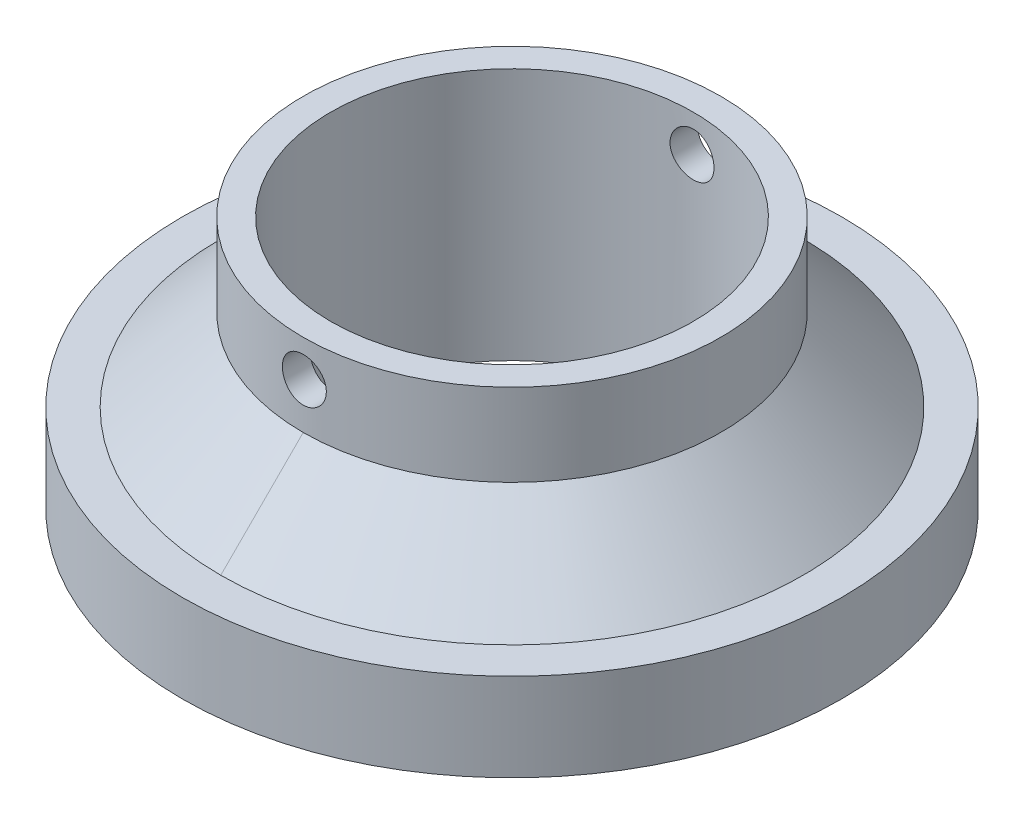
ISO-10303-21;
HEADER;
FILE_DESCRIPTION(('STEP AP214'),'2;1');
FILE_NAME('part.step','',(''),(''),'','','');
FILE_SCHEMA(('AUTOMOTIVE_DESIGN { 1 0 10303 214 1 1 1 1 }'));
ENDSEC;
DATA;
#1=APPLICATION_CONTEXT('core data for automotive mechanical design processes');
#2=APPLICATION_PROTOCOL_DEFINITION('international standard','automotive_design',2000,#1);
#3=PRODUCT_CONTEXT('',#1,'mechanical');
#4=PRODUCT('Part','Part','',(#3));
#5=PRODUCT_RELATED_PRODUCT_CATEGORY('part','',(#4));
#6=PRODUCT_DEFINITION_FORMATION('','',#4);
#7=PRODUCT_DEFINITION_CONTEXT('part definition',#1,'design');
#8=PRODUCT_DEFINITION('design','',#6,#7);
#9=PRODUCT_DEFINITION_SHAPE('','',#8);
#10=(LENGTH_UNIT() NAMED_UNIT(*) SI_UNIT(.MILLI.,.METRE.));
#11=(NAMED_UNIT(*) PLANE_ANGLE_UNIT() SI_UNIT($,.RADIAN.));
#12=(NAMED_UNIT(*) SI_UNIT($,.STERADIAN.) SOLID_ANGLE_UNIT());
#13=UNCERTAINTY_MEASURE_WITH_UNIT(LENGTH_MEASURE(1.E-05),#10,'distance_accuracy_value','');
#14=(GEOMETRIC_REPRESENTATION_CONTEXT(3) GLOBAL_UNCERTAINTY_ASSIGNED_CONTEXT((#13)) GLOBAL_UNIT_ASSIGNED_CONTEXT((#10,
#11,#12)) REPRESENTATION_CONTEXT('',''));
#15=CARTESIAN_POINT('',(0.,0.,0.));
#16=DIRECTION('',(0.,0.,1.));
#17=DIRECTION('',(1.,0.,0.));
#18=AXIS2_PLACEMENT_3D('',#15,#16,#17);
#19=CARTESIAN_POINT('',(0.,23.,0.));
#20=DIRECTION('',(0.,-1.,0.));
#21=DIRECTION('',(0.,0.,-1.));
#22=AXIS2_PLACEMENT_3D('',#19,#20,#21);
#23=CYLINDRICAL_SURFACE('',#22,19.);
#24=CARTESIAN_POINT('',(0.,23.,0.));
#25=DIRECTION('',(0.,1.,0.));
#26=DIRECTION('',(0.,0.,1.));
#27=AXIS2_PLACEMENT_3D('',#24,#25,#26);
#28=CIRCLE('',#27,19.);
#29=CARTESIAN_POINT('',(0.,23.,19.));
#30=VERTEX_POINT('',#29);
#31=EDGE_CURVE('E104',#30,#30,#28,.T.);
#32=ORIENTED_EDGE('',*,*,#31,.F.);
#33=EDGE_LOOP('',(#32));
#34=FACE_BOUND('',#33,.T.);
#35=CARTESIAN_POINT('',(0.,15.5,0.));
#36=DIRECTION('',(0.,-1.,0.));
#37=DIRECTION('',(-1.,0.,0.));
#38=AXIS2_PLACEMENT_3D('',#35,#36,#37);
#39=CIRCLE('',#38,19.);
#40=CARTESIAN_POINT('',(-19.,15.5,0.));
#41=VERTEX_POINT('',#40);
#42=CARTESIAN_POINT('',(0.,15.5,19.));
#43=VERTEX_POINT('',#42);
#44=EDGE_CURVE('E74',#41,#43,#39,.T.);
#45=ORIENTED_EDGE('',*,*,#44,.F.);
#46=CARTESIAN_POINT('',(0.,15.5,0.));
#47=DIRECTION('',(0.,-1.,0.));
#48=DIRECTION('',(0.,0.,1.));
#49=AXIS2_PLACEMENT_3D('',#46,#47,#48);
#50=CIRCLE('',#49,19.);
#51=EDGE_CURVE('E68',#43,#41,#50,.T.);
#52=ORIENTED_EDGE('',*,*,#51,.F.);
#53=EDGE_LOOP('',(#45,#52));
#54=FACE_BOUND('',#53,.T.);
#55=CARTESIAN_POINT('',(-2.,19.6595890703312,18.8944436276912));
#56=CARTESIAN_POINT('',(-1.99999516401008,19.5475825907758,18.894445005328));
#57=CARTESIAN_POINT('',(-1.9905592106298,19.4355028297355,18.8954503289405));
#58=CARTESIAN_POINT('',(-1.95306115127686,19.2144530127229,18.8993622586911));
#59=CARTESIAN_POINT('',(-1.92497872281664,19.1054864851143,18.9022709392165));
#60=CARTESIAN_POINT('',(-1.85101648610887,18.8938961437799,18.9096565465939));
#61=CARTESIAN_POINT('',(-1.80514771498838,18.7912684422582,18.914132500724));
#62=CARTESIAN_POINT('',(-1.69693653741929,18.5951898820517,18.9241471363857));
#63=CARTESIAN_POINT('',(-1.63459731484353,18.5017372545339,18.9296856124665));
#64=CARTESIAN_POINT('',(-1.49494626289544,18.3262650293538,18.9412261398914));
#65=CARTESIAN_POINT('',(-1.41758174431317,18.2442874648993,18.9472297765315));
#66=CARTESIAN_POINT('',(-1.25018900029688,18.0944545911839,18.9590098056699));
#67=CARTESIAN_POINT('',(-1.16016018629753,18.0265999386403,18.9647861875906));
#68=CARTESIAN_POINT('',(-0.969735405460029,17.9067924980374,18.9754766574711));
#69=CARTESIAN_POINT('',(-0.869315789215432,17.8548771014904,18.9803887064732));
#70=CARTESIAN_POINT('',(-0.661123884264188,17.7686611208512,18.9887797649201));
#71=CARTESIAN_POINT('',(-0.553351792795345,17.7343600644462,18.9922588127892));
#72=CARTESIAN_POINT('',(-0.333940151891589,17.6844702479526,18.9973807382535));
#73=CARTESIAN_POINT('',(-0.222316507240329,17.6688122482676,18.9990304085096));
#74=CARTESIAN_POINT('',(0.00198567037156436,17.6564387119916,19.0003308272078));
#75=CARTESIAN_POINT('',(0.114664173163608,17.6597226353102,18.9999816326435));
#76=CARTESIAN_POINT('',(0.337407304156652,17.6850836591715,18.9973292134828));
#77=CARTESIAN_POINT('',(0.447480514760363,17.7070863043041,18.9950337305466));
#78=CARTESIAN_POINT('',(0.66236313190248,17.7691441291967,18.9887555364772));
#79=CARTESIAN_POINT('',(0.767172463758145,17.8091995650053,18.9847728014133));
#80=CARTESIAN_POINT('',(0.968786058908035,17.9063071067471,18.9755544902591));
#81=CARTESIAN_POINT('',(1.0655744055176,17.963392020234,18.9703164997658));
#82=CARTESIAN_POINT('',(1.24822489495909,18.0929142569972,18.9591750971866));
#83=CARTESIAN_POINT('',(1.33408668236401,18.1653520794798,18.9532716634664));
#84=CARTESIAN_POINT('',(1.49288310796084,18.3239423013227,18.9414277296343));
#85=CARTESIAN_POINT('',(1.56575304951111,18.4101594938177,18.9354871885851));
#86=CARTESIAN_POINT('',(1.69599602157781,18.5936368214751,18.9242670764474));
#87=CARTESIAN_POINT('',(1.75336902543801,18.690896975632,18.9189875064958));
#88=CARTESIAN_POINT('',(1.85098996715941,18.8937506080875,18.9096867533654));
#89=CARTESIAN_POINT('',(1.89123368102303,18.9993461342459,18.9056658806395));
#90=CARTESIAN_POINT('',(1.9534012928652,19.2158474423839,18.8993441304434));
#91=CARTESIAN_POINT('',(1.97532581070551,19.3267530445536,18.8970431947764));
#92=CARTESIAN_POINT('',(2.00014898085295,19.5501576769732,18.8944320365128));
#93=CARTESIAN_POINT('',(2.0031382467667,19.6626465325084,18.8941123329985));
#94=CARTESIAN_POINT('',(1.99024424436211,19.8865235200879,18.8954748082176));
#95=CARTESIAN_POINT('',(1.97436125914232,19.9979116686186,18.8971569569218));
#96=CARTESIAN_POINT('',(1.9242495201604,20.2161597936848,18.9023249711416));
#97=CARTESIAN_POINT('',(1.89006381000012,20.3230297622152,18.9058066040413));
#98=CARTESIAN_POINT('',(1.80436104075002,20.5295188562511,18.914177862344));
#99=CARTESIAN_POINT('',(1.7528435432605,20.6291377982676,18.9190675233621));
#100=CARTESIAN_POINT('',(1.63371340679121,20.8187094575027,18.9297268031824));
#101=CARTESIAN_POINT('',(1.56604084168638,20.9086243306734,18.9354996688373));
#102=CARTESIAN_POINT('',(1.41660720976311,21.0758512795447,18.947264361907));
#103=CARTESIAN_POINT('',(1.334845756178,21.1531630091517,18.9532561953294));
#104=CARTESIAN_POINT('',(1.15916162206616,21.2933026771807,18.9648124158433));
#105=CARTESIAN_POINT('',(1.06519158691192,21.3560714199534,18.9703749965405));
#106=CARTESIAN_POINT('',(0.867990954149678,21.464935566177,18.9804195309464));
#107=CARTESIAN_POINT('',(0.764760495290903,21.5110312193893,18.9849015008424));
#108=CARTESIAN_POINT('',(0.55217406520502,21.5851408865819,18.9922716883864));
#109=CARTESIAN_POINT('',(0.442830566729634,21.6131903558309,18.9951630295062));
#110=CARTESIAN_POINT('',(0.220953848059182,21.6505270799506,18.9990390314887));
#111=CARTESIAN_POINT('',(0.108420727997875,21.6598149231566,19.00002375214));
#112=CARTESIAN_POINT('',(-0.116060069584251,21.6593559588526,18.9999754836866));
#113=CARTESIAN_POINT('',(-0.228007948108059,21.6497009252698,18.9989522227911));
#114=CARTESIAN_POINT('',(-0.448681769697408,21.6118230939041,18.9950221814004));
#115=CARTESIAN_POINT('',(-0.557407711015006,21.583600286048,18.9921153998833));
#116=CARTESIAN_POINT('',(-0.76854839084882,21.5094141542019,18.9847438753766));
#117=CARTESIAN_POINT('',(-0.870964201951061,21.4634538549037,18.980279398026));
#118=CARTESIAN_POINT('',(-1.06664262104474,21.3551070598317,18.9702895015986));
#119=CARTESIAN_POINT('',(-1.15990525084793,21.2927206032021,18.96476408505));
#120=CARTESIAN_POINT('',(-1.33510009597664,21.1529489564259,18.9532388767832));
#121=CARTESIAN_POINT('',(-1.41697762938841,21.0754953960436,18.947236999425));
#122=CARTESIAN_POINT('',(-1.56661295970768,20.907925075294,18.9354528101087));
#123=CARTESIAN_POINT('',(-1.63436737320411,20.8178052891746,18.9296705510343));
#124=CARTESIAN_POINT('',(-1.75398534038455,20.6271823472696,18.9189630568309));
#125=CARTESIAN_POINT('',(-1.80580406414761,20.5266509434173,18.9140402560054));
#126=CARTESIAN_POINT('',(-1.89175492720101,20.3183245467766,18.9056379230913));
#127=CARTESIAN_POINT('',(-1.92590687938195,20.2105378446898,18.9021567750991));
#128=CARTESIAN_POINT('',(-1.96710315002074,20.0283902091002,18.897903573569));
#129=CARTESIAN_POINT('',(-1.97942244283179,19.9551910379195,18.8966122914532));
#130=CARTESIAN_POINT('',(-1.99587244910145,19.8078683055102,18.8948818645099));
#131=CARTESIAN_POINT('',(-2.00000320174435,19.7337447487067,18.8944427156047));
#132=CARTESIAN_POINT('',(-2.,19.6595890703312,18.8944436276912));
#133=B_SPLINE_CURVE_WITH_KNOTS('',3,(#55,#56,#57,#58,#59,#60,#61,#62,#63,#64,#65,#66,#67,#68,
#69,#70,#71,#72,#73,#74,#75,#76,#77,#78,#79,#80,#81,#82,#83,#84,#85,#86,#87,#88,#89,#90,#91,#92,
#93,#94,#95,#96,#97,#98,#99,#100,#101,#102,#103,#104,#105,#106,#107,#108,#109,#110,#111,#112,
#113,#114,#115,#116,#117,#118,#119,#120,#121,#122,#123,#124,#125,#126,#127,#128,#129,#130,#131,
#132),.UNSPECIFIED.,.T.,.F.,(4,2,2,2,2,2,2,2,2,2,2,2,2,2,2,2,2,2,2,2,2,2,2,2,2,2,2,2,2,2,2,2,2,
2,2,2,2,2,4),(0.,0.335748617031676,0.671863762935839,1.0077706690559,1.34361268907506,
1.68065439356929,2.01771176704736,2.35555389795905,2.69338696946485,3.02996138871608,
3.36652621128152,3.70175854241439,4.03699562840617,4.37288277110583,4.70878083699377,
5.04630752720728,5.38383479799535,5.72144525317368,6.05904428425399,6.39502652549659,
6.73100372680588,7.06619423924192,7.40139323080767,7.73785548838073,8.07432698395153,
8.41214488899806,8.74995773335275,9.08710483480118,9.42424136368028,9.75974857569334,
10.0952559697202,10.4307061764935,10.7661555838795,11.1031642511509,11.4402535614886,
11.7782826675518,12.115931855138,12.3382206521887,12.5605083855275),.UNSPECIFIED.);
#134=CARTESIAN_POINT('',(-2.,19.6595890703312,18.8944436276912));
#135=VERTEX_POINT('',#134);
#136=EDGE_CURVE('E135',#135,#135,#133,.T.);
#137=ORIENTED_EDGE('',*,*,#136,.F.);
#138=EDGE_LOOP('',(#137));
#139=FACE_BOUND('',#138,.T.);
#140=CARTESIAN_POINT('',(0.,21.6595890703312,-19.));
#141=CARTESIAN_POINT('',(0.112008417844239,21.6595842360695,-18.9999986504858));
#142=CARTESIAN_POINT('',(0.22409011116156,21.6501479671379,-18.9989990230296));
#143=CARTESIAN_POINT('',(0.445143942835667,21.6126485404791,-18.9951074391116));
#144=CARTESIAN_POINT('',(0.55411255434849,21.5845650669958,-18.9922134187954));
#145=CARTESIAN_POINT('',(0.765707302443461,21.510599773361,-18.9848596062168));
#146=CARTESIAN_POINT('',(0.868337309177081,21.4647289406763,-18.9804007807146));
#147=CARTESIAN_POINT('',(1.06441973305317,21.3565129080292,-18.9704154188168));
#148=CARTESIAN_POINT('',(1.15787392189217,21.2941708969889,-18.9648890891521));
#149=CARTESIAN_POINT('',(1.33334438873615,21.1545170262972,-18.9533628684286));
#150=CARTESIAN_POINT('',(1.41531912695826,21.0771531005971,-18.9473613745813));
#151=CARTESIAN_POINT('',(1.565146544656,20.9097627296421,-18.9355744197151));
#152=CARTESIAN_POINT('',(1.63299855874326,20.8197356881025,-18.9297889688855));
#153=CARTESIAN_POINT('',(1.75280323659791,20.6293124649085,-18.9190729200505));
#154=CARTESIAN_POINT('',(1.80471802529949,20.5288923290156,-18.914144370344));
#155=CARTESIAN_POINT('',(1.89093273887728,20.3206992947572,-18.9057203232874));
#156=CARTESIAN_POINT('',(1.92523314323209,20.2129265966251,-18.9022247869301));
#157=CARTESIAN_POINT('',(1.97512160268772,19.9935130794942,-18.8970772279925));
#158=CARTESIAN_POINT('',(1.99077883849768,19.8818881528024,-18.89541839144));
#159=CARTESIAN_POINT('',(2.0031504028124,19.6575834635855,-18.8941109684303));
#160=CARTESIAN_POINT('',(1.99986527971529,19.5449037316923,-18.8944623237764));
#161=CARTESIAN_POINT('',(1.97450235287994,19.3221658826342,-18.8971293595455));
#162=CARTESIAN_POINT('',(1.9525002124111,19.2120990417304,-18.8994371310552));
#163=CARTESIAN_POINT('',(1.8904456034013,18.9972289032989,-18.9057446232425));
#164=CARTESIAN_POINT('',(1.85039286737173,18.8924256837975,-18.9097443689933));
#165=CARTESIAN_POINT('',(1.75329092276144,18.690819511491,-18.9189942182592));
#166=CARTESIAN_POINT('',(1.69620827788725,18.5940327802492,-18.924246777425));
#167=CARTESIAN_POINT('',(1.5666908868141,18.4113845601039,-18.9354083854364));
#168=CARTESIAN_POINT('',(1.49425564251871,18.3255234258127,-18.9413174555787));
#169=CARTESIAN_POINT('',(1.33566725362225,18.1667241008754,-18.9531615143885));
#170=CARTESIAN_POINT('',(1.24944878844049,18.0938511270578,-18.9590964885675));
#171=CARTESIAN_POINT('',(1.06596783254353,17.9636026427737,-18.9702964129385));
#172=CARTESIAN_POINT('',(0.968705327324303,17.9062271526602,-18.9755613622506));
#173=CARTESIAN_POINT('',(0.765851049247981,17.8086044207615,-18.9848300236665));
#174=CARTESIAN_POINT('',(0.660257600030995,17.7683606367062,-18.9888334811183));
#175=CARTESIAN_POINT('',(0.443760807693444,17.7061922484247,-18.9951255457873));
#176=CARTESIAN_POINT('',(0.332857640703189,17.684267036992,-18.9974142098446));
#177=CARTESIAN_POINT('',(0.109454154862349,17.6594412497178,-19.0000115000819));
#178=CARTESIAN_POINT('',(-0.00303606230926739,17.656450709603,-19.0003294893725));
#179=CARTESIAN_POINT('',(-0.226916078948063,17.6693426496064,-18.9989747412679));
#180=CARTESIAN_POINT('',(-0.33830589489262,17.6852248466915,-18.9973020337271));
#181=CARTESIAN_POINT('',(-0.556562384347411,17.7353367667788,-18.9921598049335));
#182=CARTESIAN_POINT('',(-0.663438869422737,17.7695242175247,-18.9886944241164));
#183=CARTESIAN_POINT('',(-0.869940226842279,17.8552326494904,-18.9803554527278));
#184=CARTESIAN_POINT('',(-0.96956492000621,17.906754058828,-18.9754818273755));
#185=CARTESIAN_POINT('',(-1.1591405212946,18.025889966259,-18.9648478148886));
#186=CARTESIAN_POINT('',(-1.2490542105761,18.0935633969774,-18.9590842083916));
#187=CARTESIAN_POINT('',(-1.4162783677793,18.2429980658676,-18.9473268886042));
#188=CARTESIAN_POINT('',(-1.49358848438461,18.3247596966082,-18.9413331689054));
#189=CARTESIAN_POINT('',(-1.63372463331255,18.5004431314758,-18.9297628392476));
#190=CARTESIAN_POINT('',(-1.69649150588153,18.5944122577905,-18.9241879932099));
#191=CARTESIAN_POINT('',(-1.80535237129506,18.7916105709793,-18.9141138909103));
#192=CARTESIAN_POINT('',(-1.85144661326567,18.8948396194609,-18.9096146185771));
#193=CARTESIAN_POINT('',(-1.92555535445661,19.1074269126383,-18.9022123156369));
#194=CARTESIAN_POINT('',(-1.95360469740686,19.2167728991503,-18.8993062103248));
#195=CARTESIAN_POINT('',(-1.99094032598198,19.4386548678653,-18.8954098830964));
#196=CARTESIAN_POINT('',(-2.0002272132674,19.5511907476598,-18.8944195997449));
#197=CARTESIAN_POINT('',(-1.99976544627054,19.7756699308933,-18.8944684327453));
#198=CARTESIAN_POINT('',(-1.99010972282517,19.8876134392068,-18.8954976416447));
#199=CARTESIAN_POINT('',(-1.95223204844791,20.1082783473035,-18.8994483350085));
#200=CARTESIAN_POINT('',(-1.92401007974408,20.2169997440023,-18.9023698212842));
#201=CARTESIAN_POINT('',(-1.8498273564277,20.4281312636612,-18.9097730829315));
#202=CARTESIAN_POINT('',(-1.80386967534044,20.5305424765858,-18.914254587945));
#203=CARTESIAN_POINT('',(-1.69552954133722,20.7262127908809,-18.92427346405));
#204=CARTESIAN_POINT('',(-1.63314712244591,20.8194719112097,-18.9298108329541));
#205=CARTESIAN_POINT('',(-1.49337993384352,20.994666919943,-18.9413500753827));
#206=CARTESIAN_POINT('',(-1.41592586926296,21.0765473920768,-18.9473540143885));
#207=CARTESIAN_POINT('',(-1.24835332858252,21.2261884161742,-18.9591311345796));
#208=CARTESIAN_POINT('',(-1.15823183336865,21.2939455924509,-18.9649042603311));
#209=CARTESIAN_POINT('',(-0.967607481740734,21.41356655299,-18.975586079652));
#210=CARTESIAN_POINT('',(-0.867076685429857,21.4653859983817,-18.9804923457825));
#211=CARTESIAN_POINT('',(-0.658751573856579,21.5513383785635,-18.9888617207062));
#212=CARTESIAN_POINT('',(-0.550965545177141,21.5854911166843,-18.9923264445262));
#213=CARTESIAN_POINT('',(-0.368815809489714,21.6266895881594,-18.9965585235102));
#214=CARTESIAN_POINT('',(-0.295613709369329,21.6390098716345,-18.9978430079455));
#215=CARTESIAN_POINT('',(-0.148285110063315,21.6554611938457,-18.9995641909453));
#216=CARTESIAN_POINT('',(-0.0741586152162601,21.6595922710027,-19.0000008934873));
#217=CARTESIAN_POINT('',(0.,21.6595890703312,-19.));
#218=B_SPLINE_CURVE_WITH_KNOTS('',3,(#140,#141,#142,#143,#144,#145,#146,#147,#148,#149,#150,
#151,#152,#153,#154,#155,#156,#157,#158,#159,#160,#161,#162,#163,#164,#165,#166,#167,#168,#169,
#170,#171,#172,#173,#174,#175,#176,#177,#178,#179,#180,#181,#182,#183,#184,#185,#186,#187,#188,
#189,#190,#191,#192,#193,#194,#195,#196,#197,#198,#199,#200,#201,#202,#203,#204,#205,#206,#207,
#208,#209,#210,#211,#212,#213,#214,#215,#216,#217),.UNSPECIFIED.,.T.,.F.,(4,2,2,2,2,2,2,2,2,2,2,
2,2,2,2,2,2,2,2,2,2,2,2,2,2,2,2,2,2,2,2,2,2,2,2,2,2,2,4),(0.,0.335754439352712,
0.671875277970159,1.00778882057924,1.34363737584089,1.68067146079848,2.01772142143432,
2.35556629403224,2.69340196971664,3.02998006509479,3.36654841628655,3.7017626251813,
4.03698180171968,4.37286352370219,4.70875614462734,5.04629056082261,5.38382542030327,
5.72142837292331,6.05902013455861,6.39500668575047,6.73098819823997,7.06619715516562,
7.4014143917639,7.73787392755746,8.07434284033892,8.41215732699427,8.74996676574404,
9.08712193908636,9.42426630061443,9.75976079635823,10.0952556132439,10.4306923163605,
10.7661283246087,11.103144648226,11.4402414318415,11.7782677107181,12.1159142565989,
12.3382118443412,12.5605083891396),.UNSPECIFIED.);
#219=CARTESIAN_POINT('',(0.,21.6595890703312,-19.));
#220=VERTEX_POINT('',#219);
#221=EDGE_CURVE('E85',#220,#220,#218,.T.);
#222=ORIENTED_EDGE('',*,*,#221,.F.);
#223=EDGE_LOOP('',(#222));
#224=FACE_BOUND('',#223,.T.);
#225=ADVANCED_FACE('F39',(#34,#54,#139,#224),#23,.T.);
#226=CARTESIAN_POINT('',(0.,0.,0.));
#227=DIRECTION('',(0.,1.,0.));
#228=DIRECTION('',(0.,0.,1.));
#229=AXIS2_PLACEMENT_3D('',#226,#227,#228);
#230=CYLINDRICAL_SURFACE('',#229,16.5);
#231=CARTESIAN_POINT('',(0.,0.,0.));
#232=DIRECTION('',(0.,1.,0.));
#233=DIRECTION('',(0.,0.,1.));
#234=AXIS2_PLACEMENT_3D('',#231,#232,#233);
#235=CIRCLE('',#234,16.5);
#236=CARTESIAN_POINT('',(0.,0.,16.5));
#237=VERTEX_POINT('',#236);
#238=EDGE_CURVE('E108',#237,#237,#235,.T.);
#239=ORIENTED_EDGE('',*,*,#238,.F.);
#240=EDGE_LOOP('',(#239));
#241=FACE_BOUND('',#240,.T.);
#242=CARTESIAN_POINT('',(0.,23.,0.));
#243=DIRECTION('',(0.,1.,0.));
#244=DIRECTION('',(0.,0.,1.));
#245=AXIS2_PLACEMENT_3D('',#242,#243,#244);
#246=CIRCLE('',#245,16.5);
#247=CARTESIAN_POINT('',(0.,23.,16.5));
#248=VERTEX_POINT('',#247);
#249=EDGE_CURVE('E94',#248,#248,#246,.T.);
#250=ORIENTED_EDGE('',*,*,#249,.T.);
#251=EDGE_LOOP('',(#250));
#252=FACE_BOUND('',#251,.T.);
#253=CARTESIAN_POINT('',(-2.,19.6595890703312,-16.3783393541592));
#254=CARTESIAN_POINT('',(-1.99999522649296,19.547691822078,-16.3783409185187));
#255=CARTESIAN_POINT('',(-1.99057757671972,19.4357239651715,-16.3794984597858));
#256=CARTESIAN_POINT('',(-1.95315651012037,19.2149023875876,-16.384001987315));
#257=CARTESIAN_POINT('',(-1.92513349612835,19.1060520768863,-16.3873502810588));
#258=CARTESIAN_POINT('',(-1.8513382764443,18.8946948132295,-16.3958506145517));
#259=CARTESIAN_POINT('',(-1.80557790389447,18.7921836839658,-16.4010014515463));
#260=CARTESIAN_POINT('',(-1.69763185962258,18.5963154693353,-16.412525048349));
#261=CARTESIAN_POINT('',(-1.63544907075832,18.5029567812521,-16.4188975936398));
#262=CARTESIAN_POINT('',(-1.49607208702632,18.3275318433374,-16.4321842030468));
#263=CARTESIAN_POINT('',(-1.41880863459792,18.245520795699,-16.4391006741216));
#264=CARTESIAN_POINT('',(-1.25161250513657,18.0955957377218,-16.4526741479335));
#265=CARTESIAN_POINT('',(-1.16167920678117,18.0276824191323,-16.4593311379254));
#266=CARTESIAN_POINT('',(-0.971350522419814,17.9076836271245,-16.4716601039847));
#267=CARTESIAN_POINT('',(-0.87092351595497,17.855647958392,-16.4773289571211));
#268=CARTESIAN_POINT('',(-0.662676240596003,17.7692005019648,-16.487016505669));
#269=CARTESIAN_POINT('',(-0.554856230576088,17.7347880975291,-16.4910352588263));
#270=CARTESIAN_POINT('',(-0.335447266315431,17.6847285202918,-16.4969528586074));
#271=CARTESIAN_POINT('',(-0.22387950310295,17.6689897110298,-16.4988620542083));
#272=CARTESIAN_POINT('',(0.000328951220168863,17.6564401713145,-16.5003807424234));
#273=CARTESIAN_POINT('',(0.11296960234533,17.6596287381909,-16.4999903204098));
#274=CARTESIAN_POINT('',(0.335503143981609,17.6847698446387,-16.4969621522789));
#275=CARTESIAN_POINT('',(0.445407351486092,17.7066238346068,-16.4943362094886));
#276=CARTESIAN_POINT('',(0.659976687576854,17.7683214663058,-16.487145354079));
#277=CARTESIAN_POINT('',(0.764641721583874,17.8081654326676,-16.4825804064701));
#278=CARTESIAN_POINT('',(0.966067665119927,17.9048173304269,-16.4720041781128));
#279=CARTESIAN_POINT('',(1.06280783529089,17.9616680686492,-16.465989255217));
#280=CARTESIAN_POINT('',(1.2454117060865,18.0906885971078,-16.4531863504219));
#281=CARTESIAN_POINT('',(1.33127493732586,18.1628590480942,-16.4463983351844));
#282=CARTESIAN_POINT('',(1.49026627622085,18.3210226904228,-16.4327577614079));
#283=CARTESIAN_POINT('',(1.5633089844355,18.4071017432475,-16.4259050684439));
#284=CARTESIAN_POINT('',(1.69392256422979,18.5903437171994,-16.4129506157796));
#285=CARTESIAN_POINT('',(1.75149339238061,18.6875066694375,-16.4068488581872));
#286=CARTESIAN_POINT('',(1.84953299154143,18.8902327029703,-16.3960871230964));
#287=CARTESIAN_POINT('',(1.88999518106057,18.9957989984093,-16.3914277006316));
#288=CARTESIAN_POINT('',(1.95259455206569,19.2122967227215,-16.3840891399048));
#289=CARTESIAN_POINT('',(1.97473256225767,19.3232279087289,-16.3814099120895));
#290=CARTESIAN_POINT('',(1.99994259792332,19.5465529937383,-16.3783513407245));
#291=CARTESIAN_POINT('',(2.00313468907436,19.6589331484031,-16.3779575142916));
#292=CARTESIAN_POINT('',(1.99067882688284,19.8826266456708,-16.3794760485732));
#293=CARTESIAN_POINT('',(1.97503125056509,19.9939400095777,-16.3813883631366));
#294=CARTESIAN_POINT('',(1.92544121857532,20.2119819704023,-16.3872905020868));
#295=CARTESIAN_POINT('',(1.89155667455309,20.3187239317469,-16.3912737488564));
#296=CARTESIAN_POINT('',(1.80651409635635,20.5250107258788,-16.4008636104032));
#297=CARTESIAN_POINT('',(1.75535548969362,20.6245553200018,-16.4064702789822));
#298=CARTESIAN_POINT('',(1.63692086663201,20.8141655614798,-16.4187100111092));
#299=CARTESIAN_POINT('',(1.56956597700828,20.9041816172528,-16.4253480394252));
#300=CARTESIAN_POINT('',(1.4207624982121,21.0716740744776,-16.4388868614111));
#301=CARTESIAN_POINT('',(1.33931339414805,21.1491500176123,-16.4457876646736));
#302=CARTESIAN_POINT('',(1.16410962811014,21.2897834854719,-16.4591188574868));
#303=CARTESIAN_POINT('',(1.0702914773461,21.3528622085339,-16.465546533504));
#304=CARTESIAN_POINT('',(0.873322319188579,21.4623659045901,-16.4771668552649));
#305=CARTESIAN_POINT('',(0.770171490291232,21.5087911960122,-16.4823595246223));
#306=CARTESIAN_POINT('',(0.557729083013191,21.5835394929079,-16.4909126846937));
#307=CARTESIAN_POINT('',(0.448453842190342,21.6119083785224,-16.49427781584));
#308=CARTESIAN_POINT('',(0.226647715919668,21.6498879133609,-16.4988159749442));
#309=CARTESIAN_POINT('',(0.114116968285447,21.6594993554577,-16.4999890955579));
#310=CARTESIAN_POINT('',(-0.110235656897404,21.6596769659729,-16.5000106837376));
#311=CARTESIAN_POINT('',(-0.222057456293726,21.6503647767273,-16.4988739988857));
#312=CARTESIAN_POINT('',(-0.442534546477707,21.6132166736707,-16.4944331628764));
#313=CARTESIAN_POINT('',(-0.551189838574083,21.5853807675157,-16.4911290126148));
#314=CARTESIAN_POINT('',(-0.762236081904073,21.5120128715155,-16.4827229362609));
#315=CARTESIAN_POINT('',(-0.86462895526625,21.4664863433338,-16.4776215650738));
#316=CARTESIAN_POINT('',(-1.06034046456029,21.3590421410264,-16.466186544165));
#317=CARTESIAN_POINT('',(-1.15365901879352,21.297124319344,-16.4598528833503));
#318=CARTESIAN_POINT('',(-1.32919482657371,21.1582038908355,-16.4466120930113));
#319=CARTESIAN_POINT('',(-1.41134016163347,21.0811107189034,-16.4397016715196));
#320=CARTESIAN_POINT('',(-1.56157646560279,20.9142151619755,-16.4261128891445));
#321=CARTESIAN_POINT('',(-1.6296640947009,20.8244097653487,-16.4194345837198));
#322=CARTESIAN_POINT('',(-1.75006185104689,20.63426661779,-16.4070402904811));
#323=CARTESIAN_POINT('',(-1.80231371897883,20.5338917632453,-16.4013278894578));
#324=CARTESIAN_POINT('',(-1.88914647603213,20.3257803480089,-16.3915542908811));
#325=CARTESIAN_POINT('',(-1.92374670293613,20.2180519906377,-16.3874912873759));
#326=CARTESIAN_POINT('',(-1.9659528966579,20.0347290045057,-16.3824694028859));
#327=CARTESIAN_POINT('',(-1.9787023532313,19.960293528553,-16.3809282826278));
#328=CARTESIAN_POINT('',(-1.99572748460383,19.8104457531826,-16.3788627344376));
#329=CARTESIAN_POINT('',(-2.00000321843775,19.7350334605739,-16.3783382994224));
#330=CARTESIAN_POINT('',(-2.,19.6595890703312,-16.3783393541592));
#331=B_SPLINE_CURVE_WITH_KNOTS('',3,(#253,#254,#255,#256,#257,#258,#259,#260,#261,#262,#263,
#264,#265,#266,#267,#268,#269,#270,#271,#272,#273,#274,#275,#276,#277,#278,#279,#280,#281,#282,
#283,#284,#285,#286,#287,#288,#289,#290,#291,#292,#293,#294,#295,#296,#297,#298,#299,#300,#301,
#302,#303,#304,#305,#306,#307,#308,#309,#310,#311,#312,#313,#314,#315,#316,#317,#318,#319,#320,
#321,#322,#323,#324,#325,#326,#327,#328,#329,#330),.UNSPECIFIED.,.T.,.F.,(4,2,2,2,2,2,2,2,2,2,2,
2,2,2,2,2,2,2,2,2,2,2,2,2,2,2,2,2,2,2,2,2,2,2,2,2,2,2,4),(0.,0.335416151251109,
0.671186160467406,1.00673255156278,1.34222007858612,1.67928620087199,2.01636885845708,
2.35449825047445,2.69261580855706,3.0290671763334,3.36550605358322,3.70017950620952,
4.03485899829225,4.37038808531351,4.70593164688521,5.04363184650338,5.3813329940199,
5.71916393324095,6.05697959331504,6.39265211408181,6.72831791738569,7.06292404634531,
7.39754126574028,7.73382224792387,8.07011551776088,8.40820752519723,8.74629306767635,
9.08351609098142,9.42072485963619,9.75577288553304,10.0908207729525,10.4257653024036,
10.7607128471746,11.0977234896435,11.4348141067622,11.7731302231021,12.1110749060593,
12.3372238391434,12.5633711966857),.UNSPECIFIED.);
#332=CARTESIAN_POINT('',(-2.,19.6595890703312,-16.3783393541592));
#333=VERTEX_POINT('',#332);
#334=EDGE_CURVE('E114',#333,#333,#331,.T.);
#335=ORIENTED_EDGE('',*,*,#334,.F.);
#336=EDGE_LOOP('',(#335));
#337=FACE_BOUND('',#336,.T.);
#338=CARTESIAN_POINT('',(0.,17.6595890703312,16.5));
#339=CARTESIAN_POINT('',(-0.111900652745753,17.6595938408357,16.4999984779065));
#340=CARTESIAN_POINT('',(-0.223871904032018,17.6690120443346,16.4988496240957));
#341=CARTESIAN_POINT('',(-0.444700533689578,17.7064355101627,16.4943771196932));
#342=CARTESIAN_POINT('',(-0.553554504762757,17.7344603576964,16.4910511775677));
#343=CARTESIAN_POINT('',(-0.764919510268095,17.8082609404961,16.4825993069214));
#344=CARTESIAN_POINT('',(-0.867434690019247,17.8540249296111,16.4774745697025));
#345=CARTESIAN_POINT('',(-1.06330969859502,17.9619794920823,16.4659955890597));
#346=CARTESIAN_POINT('',(-1.15667113512244,18.0241671737777,16.4596415621251));
#347=CARTESIAN_POINT('',(-1.33209299868107,18.1635491122496,16.4463769355912));
#348=CARTESIAN_POINT('',(-1.41409908717696,18.2408115323492,16.4394638947195));
#349=CARTESIAN_POINT('',(-1.56401456556999,18.4080035110185,16.4258801485878));
#350=CARTESIAN_POINT('',(-1.63192324849505,18.4979337044861,16.4192094554952));
#351=CARTESIAN_POINT('',(-1.75191716988259,18.6882596394812,16.4068415428533));
#352=CARTESIAN_POINT('',(-1.80395175863557,18.7886875355696,16.4011474641863));
#353=CARTESIAN_POINT('',(-1.890396973409,18.9969367435923,16.3914094269994));
#354=CARTESIAN_POINT('',(-1.92480822874977,19.1047577913649,16.3873654095577));
#355=CARTESIAN_POINT('',(-1.97486543894206,19.3241700506525,16.3814085259354));
#356=CARTESIAN_POINT('',(-1.99060291820116,19.4357400945856,16.3794852687384));
#357=CARTESIAN_POINT('',(-2.00314900757413,19.6599530232361,16.3779558032128));
#358=CARTESIAN_POINT('',(-1.99995833501188,19.7725958671357,16.378349507078));
#359=CARTESIAN_POINT('',(-1.97481387160751,19.9951201846661,16.3813999724305));
#360=CARTESIAN_POINT('',(-1.95296075085867,20.1050132237283,16.3840445916395));
#361=CARTESIAN_POINT('',(-1.89126871983955,20.3195606725996,16.3912799650409));
#362=CARTESIAN_POINT('',(-1.85142946508204,20.424214982029,16.3958707565081));
#363=CARTESIAN_POINT('',(-1.7547873702743,20.6256278352907,16.4064950132083));
#364=CARTESIAN_POINT('',(-1.69794063194365,20.7223651113022,16.4125322036319));
#365=CARTESIAN_POINT('',(-1.56892866589002,20.904964885493,16.4253661000015));
#366=CARTESIAN_POINT('',(-1.49676277915695,20.9908269155794,16.4321628386163));
#367=CARTESIAN_POINT('',(-1.33860240327758,21.1498233232656,16.4458040138629));
#368=CARTESIAN_POINT('',(-1.25252111354027,21.2228713824542,16.4526484734842));
#369=CARTESIAN_POINT('',(-1.06927274722926,21.3534946969206,16.4655725184432));
#370=CARTESIAN_POINT('',(-0.972105647621769,21.4110699200484,16.4716521021916));
#371=CARTESIAN_POINT('',(-0.769378430470083,21.5091126924906,16.4823648486936));
#372=CARTESIAN_POINT('',(-0.66381575638246,21.5495750068588,16.4869975687294));
#373=CARTESIAN_POINT('',(-0.447325912446088,21.6121757345369,16.4942905230712));
#374=CARTESIAN_POINT('',(-0.336398978895796,21.634314954212,16.4969508441783));
#375=CARTESIAN_POINT('',(-0.113075966743465,21.6595295586571,16.4999879955856));
#376=CARTESIAN_POINT('',(-0.000693503454517484,21.6627238850158,16.5003790725291));
#377=CARTESIAN_POINT('',(0.223005145792386,21.650271669312,16.4988720937279));
#378=CARTESIAN_POINT('',(0.334321353028407,21.6346255040207,16.4969740837604));
#379=CARTESIAN_POINT('',(0.552377941153378,21.5850352318122,16.4911111050895));
#380=CARTESIAN_POINT('',(0.659131367635969,21.5511476689934,16.48715252492));
#381=CARTESIAN_POINT('',(0.865439758869918,21.4660952196542,16.4776117375988));
#382=CARTESIAN_POINT('',(0.964994492436562,21.4149297785569,16.4720294783319));
#383=CARTESIAN_POINT('',(1.15461179660808,21.29648500981,16.4598284940776));
#384=CARTESIAN_POINT('',(1.24462586098187,21.2291285430258,16.4532048615695));
#385=CARTESIAN_POINT('',(1.41211356712873,21.0803230987042,16.4396778886325));
#386=CARTESIAN_POINT('',(1.48958674165607,20.9988735963254,16.4327745377939));
#387=CARTESIAN_POINT('',(1.63021400638046,20.8236710060612,16.4194223992092));
#388=CARTESIAN_POINT('',(1.69328937988266,20.7298545067065,16.4129762372037));
#389=CARTESIAN_POINT('',(1.80278720242417,20.5328895656069,16.4013110252712));
#390=CARTESIAN_POINT('',(1.84920996836413,20.4297413014931,16.3960919519932));
#391=CARTESIAN_POINT('',(1.9239566420472,20.2172974535543,16.3874895132632));
#392=CARTESIAN_POINT('',(1.95232533568764,20.1080178189057,16.384101608491));
#393=CARTESIAN_POINT('',(1.99030299852835,19.886202408106,16.3795319177777));
#394=CARTESIAN_POINT('',(1.99991278426896,19.7736667738989,16.3783500358125));
#395=CARTESIAN_POINT('',(2.00008547152799,19.5493168198413,16.3783288857002));
#396=CARTESIAN_POINT('',(1.99077203440856,19.4375025763934,16.3794744081966));
#397=CARTESIAN_POINT('',(1.9536240895631,19.2170409148566,16.38394634175));
#398=CARTESIAN_POINT('',(1.92578957627467,19.1083934977188,16.387272753462));
#399=CARTESIAN_POINT('',(1.85242753726192,18.8973633686719,16.3957270398671));
#400=CARTESIAN_POINT('',(1.80690559263951,18.7949786923976,16.400854346256));
#401=CARTESIAN_POINT('',(1.69947310215269,18.599281671131,16.4123336803137));
#402=CARTESIAN_POINT('',(1.63756239952019,18.5059694129333,16.4186857196976));
#403=CARTESIAN_POINT('',(1.49864990949873,18.3304334971301,16.4319485568618));
#404=CARTESIAN_POINT('',(1.42155592172374,18.2482830447076,16.4388626087811));
#405=CARTESIAN_POINT('',(1.2546566127553,18.0980367962284,16.4524415074047));
#406=CARTESIAN_POINT('',(1.16484829167884,18.0299443264298,16.4591062948258));
#407=CARTESIAN_POINT('',(0.974702654394307,17.9095412332666,16.4714619027491));
#408=CARTESIAN_POINT('',(0.874328764525234,17.8572880324305,16.4771491478397));
#409=CARTESIAN_POINT('',(0.666219372266619,17.7704525179539,16.4868723231325));
#410=CARTESIAN_POINT('',(0.558492066027746,17.7358508829941,16.4909100579118));
#411=CARTESIAN_POINT('',(0.375165330891702,17.6936408105948,16.4958990645665));
#412=CARTESIAN_POINT('',(0.300724781909805,17.6808896083942,16.4974294768171));
#413=CARTESIAN_POINT('',(0.150866849334733,17.6638621587405,16.4994804542477));
#414=CARTESIAN_POINT('',(0.0754494723712335,17.659585853799,16.5000010262778));
#415=CARTESIAN_POINT('',(0.,17.6595890703312,16.5));
#416=B_SPLINE_CURVE_WITH_KNOTS('',3,(#338,#339,#340,#341,#342,#343,#344,#345,#346,#347,#348,
#349,#350,#351,#352,#353,#354,#355,#356,#357,#358,#359,#360,#361,#362,#363,#364,#365,#366,#367,
#368,#369,#370,#371,#372,#373,#374,#375,#376,#377,#378,#379,#380,#381,#382,#383,#384,#385,#386,
#387,#388,#389,#390,#391,#392,#393,#394,#395,#396,#397,#398,#399,#400,#401,#402,#403,#404,#405,
#406,#407,#408,#409,#410,#411,#412,#413,#414,#415),.UNSPECIFIED.,.T.,.F.,(4,2,2,2,2,2,2,2,2,2,2,
2,2,2,2,2,2,2,2,2,2,2,2,2,2,2,2,2,2,2,2,2,2,2,2,2,2,2,4),(0.,0.335426378665763,
0.671206385389909,1.00676443077977,1.34226343500719,1.6793161714136,2.01638580662739,
2.35451994966468,2.69264201726069,3.02909993522792,3.3655451024651,3.70018677840282,
4.03483486398249,4.37035427825133,4.70588812906054,5.04360200462308,5.38131658189113,
5.71913439357578,6.05693733773906,6.39261719196973,6.72829033340282,7.0629289078826,
7.39757822445073,7.7338546685743,8.07014363872965,8.40822935978568,8.74630864669797,
9.08354597302305,9.42076861970789,9.75579463865945,10.0908207582288,10.4257412492092,
10.7606649440165,11.0976889186223,11.4347925452798,11.7731040558593,12.111044453397,
12.3372085940178,12.5633712004793),.UNSPECIFIED.);
#417=CARTESIAN_POINT('',(0.,17.6595890703312,16.5));
#418=VERTEX_POINT('',#417);
#419=EDGE_CURVE('E43',#418,#418,#416,.T.);
#420=ORIENTED_EDGE('',*,*,#419,.F.);
#421=EDGE_LOOP('',(#420));
#422=FACE_BOUND('',#421,.T.);
#423=ADVANCED_FACE('F120',(#241,#252,#337,#422),#230,.F.);
#424=CARTESIAN_POINT('',(0.,8.,0.));
#425=DIRECTION('',(0.,1.,0.));
#426=DIRECTION('',(0.,0.,1.));
#427=AXIS2_PLACEMENT_3D('',#424,#425,#426);
#428=PLANE('',#427);
#429=CARTESIAN_POINT('',(0.,8.,0.));
#430=DIRECTION('',(0.,-1.,0.));
#431=DIRECTION('',(0.,0.,1.));
#432=AXIS2_PLACEMENT_3D('',#429,#430,#431);
#433=CIRCLE('',#432,26.5);
#434=CARTESIAN_POINT('',(0.,8.,26.5));
#435=VERTEX_POINT('',#434);
#436=CARTESIAN_POINT('',(-26.5,8.,0.));
#437=VERTEX_POINT('',#436);
#438=EDGE_CURVE('E90',#435,#437,#433,.T.);
#439=ORIENTED_EDGE('',*,*,#438,.T.);
#440=CARTESIAN_POINT('',(0.,8.,0.));
#441=DIRECTION('',(0.,-1.,0.));
#442=DIRECTION('',(-1.,0.,0.));
#443=AXIS2_PLACEMENT_3D('',#440,#441,#442);
#444=CIRCLE('',#443,26.5);
#445=EDGE_CURVE('E79',#437,#435,#444,.T.);
#446=ORIENTED_EDGE('',*,*,#445,.T.);
#447=EDGE_LOOP('',(#439,#446));
#448=FACE_BOUND('',#447,.T.);
#449=CARTESIAN_POINT('',(0.,8.,0.));
#450=DIRECTION('',(0.,1.,0.));
#451=DIRECTION('',(0.,0.,1.));
#452=AXIS2_PLACEMENT_3D('',#449,#450,#451);
#453=CIRCLE('',#452,30.);
#454=CARTESIAN_POINT('',(0.,8.,30.));
#455=VERTEX_POINT('',#454);
#456=EDGE_CURVE('E11',#455,#455,#453,.T.);
#457=ORIENTED_EDGE('',*,*,#456,.T.);
#458=EDGE_LOOP('',(#457));
#459=FACE_BOUND('',#458,.T.);
#460=ADVANCED_FACE('F176',(#448,#459),#428,.T.);
#461=CARTESIAN_POINT('',(0.,8.,0.));
#462=DIRECTION('',(0.,-1.,0.));
#463=DIRECTION('',(0.,0.,-1.));
#464=AXIS2_PLACEMENT_3D('',#461,#462,#463);
#465=CYLINDRICAL_SURFACE('',#464,30.);
#466=ORIENTED_EDGE('',*,*,#456,.F.);
#467=EDGE_LOOP('',(#466));
#468=FACE_BOUND('',#467,.T.);
#469=CARTESIAN_POINT('',(0.,0.,0.));
#470=DIRECTION('',(0.,1.,0.));
#471=DIRECTION('',(0.,0.,1.));
#472=AXIS2_PLACEMENT_3D('',#469,#470,#471);
#473=CIRCLE('',#472,30.);
#474=CARTESIAN_POINT('',(0.,0.,30.));
#475=VERTEX_POINT('',#474);
#476=EDGE_CURVE('E54',#475,#475,#473,.T.);
#477=ORIENTED_EDGE('',*,*,#476,.T.);
#478=EDGE_LOOP('',(#477));
#479=FACE_BOUND('',#478,.T.);
#480=ADVANCED_FACE('F41',(#468,#479),#465,.T.);
#481=CARTESIAN_POINT('',(0.,0.,0.));
#482=DIRECTION('',(0.,1.,0.));
#483=DIRECTION('',(0.,0.,1.));
#484=AXIS2_PLACEMENT_3D('',#481,#482,#483);
#485=PLANE('',#484);
#486=ORIENTED_EDGE('',*,*,#238,.T.);
#487=EDGE_LOOP('',(#486));
#488=FACE_BOUND('',#487,.T.);
#489=ORIENTED_EDGE('',*,*,#476,.F.);
#490=EDGE_LOOP('',(#489));
#491=FACE_BOUND('',#490,.T.);
#492=ADVANCED_FACE('F151',(#488,#491),#485,.F.);
#493=CARTESIAN_POINT('',(0.,23.,0.));
#494=DIRECTION('',(0.,1.,0.));
#495=DIRECTION('',(0.,0.,1.));
#496=AXIS2_PLACEMENT_3D('',#493,#494,#495);
#497=PLANE('',#496);
#498=ORIENTED_EDGE('',*,*,#31,.T.);
#499=EDGE_LOOP('',(#498));
#500=FACE_BOUND('',#499,.T.);
#501=ORIENTED_EDGE('',*,*,#249,.F.);
#502=EDGE_LOOP('',(#501));
#503=FACE_BOUND('',#502,.T.);
#504=ADVANCED_FACE('F148',(#500,#503),#497,.T.);
#505=CARTESIAN_POINT('',(0.,15.5,0.));
#506=DIRECTION('',(0.,-1.,0.));
#507=DIRECTION('',(0.,0.,-1.));
#508=AXIS2_PLACEMENT_3D('',#505,#506,#507);
#509=CONICAL_SURFACE('',#508,19.,0.785398163397448);
#510=ORIENTED_EDGE('',*,*,#445,.F.);
#511=DIRECTION('',(-0.707106781186547,-0.707106781186547,0.));
#512=VECTOR('',#511,1.);
#513=CARTESIAN_POINT('',(-26.5,8.,0.));
#514=LINE('',#513,#512);
#515=EDGE_CURVE('E62',#41,#437,#514,.T.);
#516=ORIENTED_EDGE('',*,*,#515,.F.);
#517=ORIENTED_EDGE('',*,*,#44,.T.);
#518=DIRECTION('',(0.,-0.707106781186547,0.707106781186547));
#519=VECTOR('',#518,1.);
#520=CARTESIAN_POINT('',(0.,8.,26.5));
#521=LINE('',#520,#519);
#522=EDGE_CURVE('E88',#43,#435,#521,.T.);
#523=ORIENTED_EDGE('',*,*,#522,.T.);
#524=EDGE_LOOP('',(#510,#516,#517,#523));
#525=FACE_BOUND('',#524,.T.);
#526=ADVANCED_FACE('F81',(#525),#509,.T.);
#527=CARTESIAN_POINT('',(0.,15.5,0.));
#528=DIRECTION('',(0.,-1.,0.));
#529=DIRECTION('',(0.,0.,-1.));
#530=AXIS2_PLACEMENT_3D('',#527,#528,#529);
#531=CONICAL_SURFACE('',#530,19.,0.785398163397448);
#532=ORIENTED_EDGE('',*,*,#51,.T.);
#533=ORIENTED_EDGE('',*,*,#515,.T.);
#534=ORIENTED_EDGE('',*,*,#438,.F.);
#535=ORIENTED_EDGE('',*,*,#522,.F.);
#536=EDGE_LOOP('',(#532,#533,#534,#535));
#537=FACE_BOUND('',#536,.T.);
#538=ADVANCED_FACE('F87',(#537),#531,.T.);
#539=CARTESIAN_POINT('',(0.,19.6595890703312,26.));
#540=DIRECTION('',(0.,0.,-1.));
#541=DIRECTION('',(-1.,0.,0.));
#542=AXIS2_PLACEMENT_3D('',#539,#540,#541);
#543=CYLINDRICAL_SURFACE('',#542,2.);
#544=ORIENTED_EDGE('',*,*,#334,.T.);
#545=EDGE_LOOP('',(#544));
#546=FACE_BOUND('',#545,.T.);
#547=ORIENTED_EDGE('',*,*,#221,.T.);
#548=EDGE_LOOP('',(#547));
#549=FACE_BOUND('',#548,.T.);
#550=ADVANCED_FACE('F124',(#546,#549),#543,.F.);
#551=ORIENTED_EDGE('',*,*,#419,.T.);
#552=EDGE_LOOP('',(#551));
#553=FACE_BOUND('',#552,.T.);
#554=ORIENTED_EDGE('',*,*,#136,.T.);
#555=EDGE_LOOP('',(#554));
#556=FACE_BOUND('',#555,.T.);
#557=ADVANCED_FACE('F128',(#553,#556),#543,.F.);
#558=CLOSED_SHELL('',(#225,#423,#460,#480,#492,#504,#526,#538,#550,#557));
#559=MANIFOLD_SOLID_BREP('B2',#558);
#560=ADVANCED_BREP_SHAPE_REPRESENTATION('',(#18,#559),#14);
#561=SHAPE_DEFINITION_REPRESENTATION(#9,#560);
ENDSEC;
END-ISO-10303-21;
